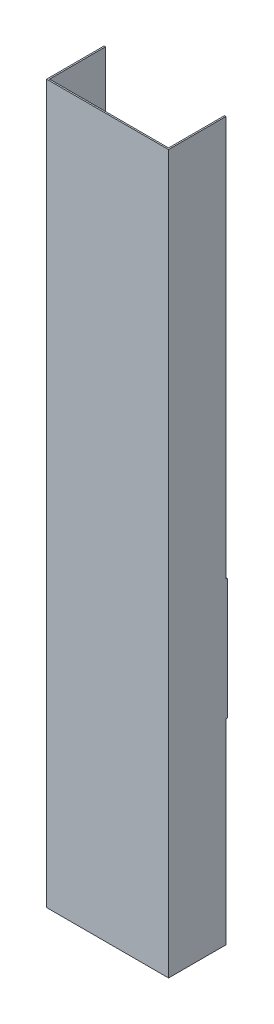
ISO-10303-21;
HEADER;
FILE_DESCRIPTION(('STEP AP214'),'2;1');
FILE_NAME('part.step','',(''),(''),'','','');
FILE_SCHEMA(('AUTOMOTIVE_DESIGN { 1 0 10303 214 1 1 1 1 }'));
ENDSEC;
DATA;
#1=APPLICATION_CONTEXT('core data for automotive mechanical design processes');
#2=APPLICATION_PROTOCOL_DEFINITION('international standard','automotive_design',2000,#1);
#3=PRODUCT_CONTEXT('',#1,'mechanical');
#4=PRODUCT('Part','Part','',(#3));
#5=PRODUCT_RELATED_PRODUCT_CATEGORY('part','',(#4));
#6=PRODUCT_DEFINITION_FORMATION('','',#4);
#7=PRODUCT_DEFINITION_CONTEXT('part definition',#1,'design');
#8=PRODUCT_DEFINITION('design','',#6,#7);
#9=PRODUCT_DEFINITION_SHAPE('','',#8);
#10=(LENGTH_UNIT() NAMED_UNIT(*) SI_UNIT(.MILLI.,.METRE.));
#11=(NAMED_UNIT(*) PLANE_ANGLE_UNIT() SI_UNIT($,.RADIAN.));
#12=(NAMED_UNIT(*) SI_UNIT($,.STERADIAN.) SOLID_ANGLE_UNIT());
#13=UNCERTAINTY_MEASURE_WITH_UNIT(LENGTH_MEASURE(1.E-05),#10,'distance_accuracy_value','');
#14=(GEOMETRIC_REPRESENTATION_CONTEXT(3) GLOBAL_UNCERTAINTY_ASSIGNED_CONTEXT((#13)) GLOBAL_UNIT_ASSIGNED_CONTEXT((#10,
#11,#12)) REPRESENTATION_CONTEXT('',''));
#15=CARTESIAN_POINT('',(0.,0.,0.));
#16=DIRECTION('',(0.,0.,1.));
#17=DIRECTION('',(1.,0.,0.));
#18=AXIS2_PLACEMENT_3D('',#15,#16,#17);
#19=CARTESIAN_POINT('',(1.,500.,0.));
#20=DIRECTION('',(0.,0.,1.));
#21=DIRECTION('',(1.,0.,0.));
#22=AXIS2_PLACEMENT_3D('',#19,#20,#21);
#23=PLANE('',#22);
#24=DIRECTION('',(-1.,0.,0.));
#25=VECTOR('',#24,1.);
#26=CARTESIAN_POINT('',(85.,136.481800745814,0.));
#27=LINE('',#26,#25);
#28=CARTESIAN_POINT('',(1.,136.481800745814,0.));
#29=VERTEX_POINT('',#28);
#30=CARTESIAN_POINT('',(0.,136.481800745814,0.));
#31=VERTEX_POINT('',#30);
#32=EDGE_CURVE('E232',#29,#31,#27,.T.);
#33=ORIENTED_EDGE('',*,*,#32,.F.);
#34=DIRECTION('',(0.,-1.,0.));
#35=VECTOR('',#34,1.);
#36=CARTESIAN_POINT('',(1.,500.,0.));
#37=LINE('',#36,#35);
#38=CARTESIAN_POINT('',(1.,0.,0.));
#39=VERTEX_POINT('',#38);
#40=EDGE_CURVE('E183',#29,#39,#37,.T.);
#41=ORIENTED_EDGE('',*,*,#40,.T.);
#42=DIRECTION('',(-1.,0.,0.));
#43=VECTOR('',#42,1.);
#44=CARTESIAN_POINT('',(1.,0.,0.));
#45=LINE('',#44,#43);
#46=CARTESIAN_POINT('',(0.,0.,0.));
#47=VERTEX_POINT('',#46);
#48=EDGE_CURVE('E159',#39,#47,#45,.T.);
#49=ORIENTED_EDGE('',*,*,#48,.T.);
#50=DIRECTION('',(0.,-1.,0.));
#51=VECTOR('',#50,1.);
#52=CARTESIAN_POINT('',(0.,500.,0.));
#53=LINE('',#52,#51);
#54=EDGE_CURVE('E39',#31,#47,#53,.T.);
#55=ORIENTED_EDGE('',*,*,#54,.F.);
#56=EDGE_LOOP('',(#33,#41,#49,#55));
#57=FACE_BOUND('',#56,.T.);
#58=ADVANCED_FACE('F32',(#57),#23,.F.);
#59=DIRECTION('',(1.,0.,0.));
#60=VECTOR('',#59,1.);
#61=CARTESIAN_POINT('',(85.,220.695563906895,0.));
#62=LINE('',#61,#60);
#63=CARTESIAN_POINT('',(0.,220.695563906895,0.));
#64=VERTEX_POINT('',#63);
#65=CARTESIAN_POINT('',(1.,220.695563906895,0.));
#66=VERTEX_POINT('',#65);
#67=EDGE_CURVE('E53',#64,#66,#62,.T.);
#68=ORIENTED_EDGE('',*,*,#67,.F.);
#69=CARTESIAN_POINT('',(0.,500.,0.));
#70=VERTEX_POINT('',#69);
#71=EDGE_CURVE('E11',#70,#64,#53,.T.);
#72=ORIENTED_EDGE('',*,*,#71,.F.);
#73=DIRECTION('',(-1.,0.,0.));
#74=VECTOR('',#73,1.);
#75=CARTESIAN_POINT('',(1.,500.,0.));
#76=LINE('',#75,#74);
#77=CARTESIAN_POINT('',(1.,500.,0.));
#78=VERTEX_POINT('',#77);
#79=EDGE_CURVE('E165',#78,#70,#76,.T.);
#80=ORIENTED_EDGE('',*,*,#79,.F.);
#81=EDGE_CURVE('E200',#78,#66,#37,.T.);
#82=ORIENTED_EDGE('',*,*,#81,.T.);
#83=EDGE_LOOP('',(#68,#72,#80,#82));
#84=FACE_BOUND('',#83,.T.);
#85=ADVANCED_FACE('F280',(#84),#23,.F.);
#86=CARTESIAN_POINT('',(85.,500.,0.));
#87=DIRECTION('',(0.,0.,1.));
#88=DIRECTION('',(1.,0.,0.));
#89=AXIS2_PLACEMENT_3D('',#86,#87,#88);
#90=PLANE('',#89);
#91=CARTESIAN_POINT('',(85.,136.481800745814,0.));
#92=VERTEX_POINT('',#91);
#93=CARTESIAN_POINT('',(84.,136.481800745814,0.));
#94=VERTEX_POINT('',#93);
#95=EDGE_CURVE('E270',#92,#94,#27,.T.);
#96=ORIENTED_EDGE('',*,*,#95,.F.);
#97=DIRECTION('',(0.,-1.,0.));
#98=VECTOR('',#97,1.);
#99=CARTESIAN_POINT('',(85.,500.,0.));
#100=LINE('',#99,#98);
#101=CARTESIAN_POINT('',(85.,0.,0.));
#102=VERTEX_POINT('',#101);
#103=EDGE_CURVE('E156',#92,#102,#100,.T.);
#104=ORIENTED_EDGE('',*,*,#103,.T.);
#105=DIRECTION('',(-1.,0.,0.));
#106=VECTOR('',#105,1.);
#107=CARTESIAN_POINT('',(85.,0.,0.));
#108=LINE('',#107,#106);
#109=CARTESIAN_POINT('',(84.,0.,0.));
#110=VERTEX_POINT('',#109);
#111=EDGE_CURVE('E191',#102,#110,#108,.T.);
#112=ORIENTED_EDGE('',*,*,#111,.T.);
#113=DIRECTION('',(0.,-1.,0.));
#114=VECTOR('',#113,1.);
#115=CARTESIAN_POINT('',(84.,500.,0.));
#116=LINE('',#115,#114);
#117=EDGE_CURVE('E209',#94,#110,#116,.T.);
#118=ORIENTED_EDGE('',*,*,#117,.F.);
#119=EDGE_LOOP('',(#96,#104,#112,#118));
#120=FACE_BOUND('',#119,.T.);
#121=ADVANCED_FACE('F251',(#120),#90,.F.);
#122=CARTESIAN_POINT('',(84.,220.695563906895,0.));
#123=VERTEX_POINT('',#122);
#124=CARTESIAN_POINT('',(85.,220.695563906895,0.));
#125=VERTEX_POINT('',#124);
#126=EDGE_CURVE('E269',#123,#125,#62,.T.);
#127=ORIENTED_EDGE('',*,*,#126,.F.);
#128=CARTESIAN_POINT('',(84.,500.,0.));
#129=VERTEX_POINT('',#128);
#130=EDGE_CURVE('E210',#129,#123,#116,.T.);
#131=ORIENTED_EDGE('',*,*,#130,.F.);
#132=DIRECTION('',(-1.,0.,0.));
#133=VECTOR('',#132,1.);
#134=CARTESIAN_POINT('',(85.,500.,0.));
#135=LINE('',#134,#133);
#136=CARTESIAN_POINT('',(85.,500.,0.));
#137=VERTEX_POINT('',#136);
#138=EDGE_CURVE('E175',#137,#129,#135,.T.);
#139=ORIENTED_EDGE('',*,*,#138,.F.);
#140=EDGE_CURVE('E213',#137,#125,#100,.T.);
#141=ORIENTED_EDGE('',*,*,#140,.T.);
#142=EDGE_LOOP('',(#127,#131,#139,#141));
#143=FACE_BOUND('',#142,.T.);
#144=ADVANCED_FACE('F286',(#143),#90,.F.);
#145=CARTESIAN_POINT('',(0.,500.,0.));
#146=DIRECTION('',(1.,0.,0.));
#147=DIRECTION('',(0.,0.,-1.));
#148=AXIS2_PLACEMENT_3D('',#145,#146,#147);
#149=PLANE('',#148);
#150=DIRECTION('',(0.,0.,1.));
#151=VECTOR('',#150,1.);
#152=CARTESIAN_POINT('',(0.,0.,0.));
#153=LINE('',#152,#151);
#154=CARTESIAN_POINT('',(0.,0.,40.));
#155=VERTEX_POINT('',#154);
#156=EDGE_CURVE('E185',#47,#155,#153,.T.);
#157=ORIENTED_EDGE('',*,*,#156,.T.);
#158=DIRECTION('',(0.,-1.,0.));
#159=VECTOR('',#158,1.);
#160=CARTESIAN_POINT('',(0.,500.,40.));
#161=LINE('',#160,#159);
#162=CARTESIAN_POINT('',(0.,500.,40.));
#163=VERTEX_POINT('',#162);
#164=EDGE_CURVE('E218',#163,#155,#161,.T.);
#165=ORIENTED_EDGE('',*,*,#164,.F.);
#166=DIRECTION('',(0.,0.,1.));
#167=VECTOR('',#166,1.);
#168=CARTESIAN_POINT('',(0.,500.,0.));
#169=LINE('',#168,#167);
#170=EDGE_CURVE('E168',#70,#163,#169,.T.);
#171=ORIENTED_EDGE('',*,*,#170,.F.);
#172=ORIENTED_EDGE('',*,*,#71,.T.);
#173=DIRECTION('',(0.,0.,1.));
#174=VECTOR('',#173,1.);
#175=CARTESIAN_POINT('',(0.,220.695563906895,-1.));
#176=LINE('',#175,#174);
#177=CARTESIAN_POINT('',(0.,220.695563906895,-1.));
#178=VERTEX_POINT('',#177);
#179=EDGE_CURVE('E161',#178,#64,#176,.T.);
#180=ORIENTED_EDGE('',*,*,#179,.F.);
#181=DIRECTION('',(0.,1.,0.));
#182=VECTOR('',#181,1.);
#183=CARTESIAN_POINT('',(0.,220.695563906895,-1.));
#184=LINE('',#183,#182);
#185=CARTESIAN_POINT('',(0.,136.481800745814,-1.));
#186=VERTEX_POINT('',#185);
#187=EDGE_CURVE('E142',#186,#178,#184,.T.);
#188=ORIENTED_EDGE('',*,*,#187,.F.);
#189=DIRECTION('',(0.,0.,1.));
#190=VECTOR('',#189,1.);
#191=CARTESIAN_POINT('',(0.,136.481800745814,-1.));
#192=LINE('',#191,#190);
#193=EDGE_CURVE('E139',#186,#31,#192,.T.);
#194=ORIENTED_EDGE('',*,*,#193,.T.);
#195=ORIENTED_EDGE('',*,*,#54,.T.);
#196=EDGE_LOOP('',(#157,#165,#171,#172,#180,#188,#194,#195));
#197=FACE_BOUND('',#196,.T.);
#198=ADVANCED_FACE('F226',(#197),#149,.F.);
#199=CARTESIAN_POINT('',(0.,500.,40.));
#200=DIRECTION('',(0.,0.,-1.));
#201=DIRECTION('',(-1.,0.,0.));
#202=AXIS2_PLACEMENT_3D('',#199,#200,#201);
#203=PLANE('',#202);
#204=DIRECTION('',(1.,0.,0.));
#205=VECTOR('',#204,1.);
#206=CARTESIAN_POINT('',(0.,0.,40.));
#207=LINE('',#206,#205);
#208=CARTESIAN_POINT('',(85.,0.,40.));
#209=VERTEX_POINT('',#208);
#210=EDGE_CURVE('E187',#155,#209,#207,.T.);
#211=ORIENTED_EDGE('',*,*,#210,.T.);
#212=DIRECTION('',(0.,-1.,0.));
#213=VECTOR('',#212,1.);
#214=CARTESIAN_POINT('',(85.,500.,40.));
#215=LINE('',#214,#213);
#216=CARTESIAN_POINT('',(85.,500.,40.));
#217=VERTEX_POINT('',#216);
#218=EDGE_CURVE('E216',#217,#209,#215,.T.);
#219=ORIENTED_EDGE('',*,*,#218,.F.);
#220=DIRECTION('',(1.,0.,0.));
#221=VECTOR('',#220,1.);
#222=CARTESIAN_POINT('',(0.,500.,40.));
#223=LINE('',#222,#221);
#224=EDGE_CURVE('E171',#163,#217,#223,.T.);
#225=ORIENTED_EDGE('',*,*,#224,.F.);
#226=ORIENTED_EDGE('',*,*,#164,.T.);
#227=EDGE_LOOP('',(#211,#219,#225,#226));
#228=FACE_BOUND('',#227,.T.);
#229=ADVANCED_FACE('F255',(#228),#203,.F.);
#230=CARTESIAN_POINT('',(85.,500.,40.));
#231=DIRECTION('',(-1.,0.,0.));
#232=DIRECTION('',(0.,0.,1.));
#233=AXIS2_PLACEMENT_3D('',#230,#231,#232);
#234=PLANE('',#233);
#235=DIRECTION('',(0.,0.,-1.));
#236=VECTOR('',#235,1.);
#237=CARTESIAN_POINT('',(85.,0.,40.));
#238=LINE('',#237,#236);
#239=EDGE_CURVE('E189',#209,#102,#238,.T.);
#240=ORIENTED_EDGE('',*,*,#239,.T.);
#241=ORIENTED_EDGE('',*,*,#103,.F.);
#242=DIRECTION('',(0.,0.,1.));
#243=VECTOR('',#242,1.);
#244=CARTESIAN_POINT('',(85.,136.481800745814,-1.));
#245=LINE('',#244,#243);
#246=CARTESIAN_POINT('',(85.,136.481800745814,-1.));
#247=VERTEX_POINT('',#246);
#248=EDGE_CURVE('E136',#247,#92,#245,.T.);
#249=ORIENTED_EDGE('',*,*,#248,.F.);
#250=DIRECTION('',(0.,-1.,0.));
#251=VECTOR('',#250,1.);
#252=CARTESIAN_POINT('',(85.,220.695563906895,-1.));
#253=LINE('',#252,#251);
#254=CARTESIAN_POINT('',(85.,220.695563906895,-1.));
#255=VERTEX_POINT('',#254);
#256=EDGE_CURVE('E143',#255,#247,#253,.T.);
#257=ORIENTED_EDGE('',*,*,#256,.F.);
#258=DIRECTION('',(0.,0.,1.));
#259=VECTOR('',#258,1.);
#260=CARTESIAN_POINT('',(85.,220.695563906895,-1.));
#261=LINE('',#260,#259);
#262=EDGE_CURVE('E264',#255,#125,#261,.T.);
#263=ORIENTED_EDGE('',*,*,#262,.T.);
#264=ORIENTED_EDGE('',*,*,#140,.F.);
#265=DIRECTION('',(0.,0.,-1.));
#266=VECTOR('',#265,1.);
#267=CARTESIAN_POINT('',(85.,500.,40.));
#268=LINE('',#267,#266);
#269=EDGE_CURVE('E173',#217,#137,#268,.T.);
#270=ORIENTED_EDGE('',*,*,#269,.F.);
#271=ORIENTED_EDGE('',*,*,#218,.T.);
#272=EDGE_LOOP('',(#240,#241,#249,#257,#263,#264,#270,#271));
#273=FACE_BOUND('',#272,.T.);
#274=ADVANCED_FACE('F155',(#273),#234,.F.);
#275=CARTESIAN_POINT('',(84.,500.,39.));
#276=DIRECTION('',(1.,0.,0.));
#277=DIRECTION('',(0.,0.,-1.));
#278=AXIS2_PLACEMENT_3D('',#275,#276,#277);
#279=PLANE('',#278);
#280=DIRECTION('',(0.,0.,1.));
#281=VECTOR('',#280,1.);
#282=CARTESIAN_POINT('',(84.,0.,39.));
#283=LINE('',#282,#281);
#284=CARTESIAN_POINT('',(84.,0.,39.));
#285=VERTEX_POINT('',#284);
#286=EDGE_CURVE('E194',#110,#285,#283,.T.);
#287=ORIENTED_EDGE('',*,*,#286,.T.);
#288=DIRECTION('',(0.,-1.,0.));
#289=VECTOR('',#288,1.);
#290=CARTESIAN_POINT('',(84.,500.,39.));
#291=LINE('',#290,#289);
#292=CARTESIAN_POINT('',(84.,500.,39.));
#293=VERTEX_POINT('',#292);
#294=EDGE_CURVE('E206',#293,#285,#291,.T.);
#295=ORIENTED_EDGE('',*,*,#294,.F.);
#296=DIRECTION('',(0.,0.,1.));
#297=VECTOR('',#296,1.);
#298=CARTESIAN_POINT('',(84.,500.,39.));
#299=LINE('',#298,#297);
#300=EDGE_CURVE('E177',#129,#293,#299,.T.);
#301=ORIENTED_EDGE('',*,*,#300,.F.);
#302=ORIENTED_EDGE('',*,*,#130,.T.);
#303=DIRECTION('',(0.,1.,0.));
#304=VECTOR('',#303,1.);
#305=CARTESIAN_POINT('',(84.,500.,0.));
#306=LINE('',#305,#304);
#307=EDGE_CURVE('E157',#94,#123,#306,.T.);
#308=ORIENTED_EDGE('',*,*,#307,.F.);
#309=ORIENTED_EDGE('',*,*,#117,.T.);
#310=EDGE_LOOP('',(#287,#295,#301,#302,#308,#309));
#311=FACE_BOUND('',#310,.T.);
#312=ADVANCED_FACE('F247',(#311),#279,.F.);
#313=CARTESIAN_POINT('',(1.,500.,39.));
#314=DIRECTION('',(0.,0.,1.));
#315=DIRECTION('',(1.,0.,0.));
#316=AXIS2_PLACEMENT_3D('',#313,#314,#315);
#317=PLANE('',#316);
#318=DIRECTION('',(-1.,0.,0.));
#319=VECTOR('',#318,1.);
#320=CARTESIAN_POINT('',(1.,0.,39.));
#321=LINE('',#320,#319);
#322=CARTESIAN_POINT('',(1.,0.,39.));
#323=VERTEX_POINT('',#322);
#324=EDGE_CURVE('E196',#285,#323,#321,.T.);
#325=ORIENTED_EDGE('',*,*,#324,.T.);
#326=DIRECTION('',(0.,-1.,0.));
#327=VECTOR('',#326,1.);
#328=CARTESIAN_POINT('',(1.,500.,39.));
#329=LINE('',#328,#327);
#330=CARTESIAN_POINT('',(1.,500.,39.));
#331=VERTEX_POINT('',#330);
#332=EDGE_CURVE('E202',#331,#323,#329,.T.);
#333=ORIENTED_EDGE('',*,*,#332,.F.);
#334=DIRECTION('',(-1.,0.,0.));
#335=VECTOR('',#334,1.);
#336=CARTESIAN_POINT('',(1.,500.,39.));
#337=LINE('',#336,#335);
#338=EDGE_CURVE('E179',#293,#331,#337,.T.);
#339=ORIENTED_EDGE('',*,*,#338,.F.);
#340=ORIENTED_EDGE('',*,*,#294,.T.);
#341=EDGE_LOOP('',(#325,#333,#339,#340));
#342=FACE_BOUND('',#341,.T.);
#343=ADVANCED_FACE('F242',(#342),#317,.F.);
#344=CARTESIAN_POINT('',(1.,500.,0.));
#345=DIRECTION('',(-1.,0.,0.));
#346=DIRECTION('',(0.,0.,1.));
#347=AXIS2_PLACEMENT_3D('',#344,#345,#346);
#348=PLANE('',#347);
#349=DIRECTION('',(0.,0.,-1.));
#350=VECTOR('',#349,1.);
#351=CARTESIAN_POINT('',(1.,0.,0.));
#352=LINE('',#351,#350);
#353=EDGE_CURVE('E169',#323,#39,#352,.T.);
#354=ORIENTED_EDGE('',*,*,#353,.T.);
#355=ORIENTED_EDGE('',*,*,#40,.F.);
#356=EDGE_CURVE('E203',#66,#29,#37,.T.);
#357=ORIENTED_EDGE('',*,*,#356,.F.);
#358=ORIENTED_EDGE('',*,*,#81,.F.);
#359=DIRECTION('',(0.,0.,-1.));
#360=VECTOR('',#359,1.);
#361=CARTESIAN_POINT('',(1.,500.,0.));
#362=LINE('',#361,#360);
#363=EDGE_CURVE('E181',#331,#78,#362,.T.);
#364=ORIENTED_EDGE('',*,*,#363,.F.);
#365=ORIENTED_EDGE('',*,*,#332,.T.);
#366=EDGE_LOOP('',(#354,#355,#357,#358,#364,#365));
#367=FACE_BOUND('',#366,.T.);
#368=ADVANCED_FACE('F235',(#367),#348,.F.);
#369=CARTESIAN_POINT('',(0.,500.,0.));
#370=DIRECTION('',(0.,1.,0.));
#371=DIRECTION('',(0.,0.,1.));
#372=AXIS2_PLACEMENT_3D('',#369,#370,#371);
#373=PLANE('',#372);
#374=ORIENTED_EDGE('',*,*,#79,.T.);
#375=ORIENTED_EDGE('',*,*,#170,.T.);
#376=ORIENTED_EDGE('',*,*,#224,.T.);
#377=ORIENTED_EDGE('',*,*,#269,.T.);
#378=ORIENTED_EDGE('',*,*,#138,.T.);
#379=ORIENTED_EDGE('',*,*,#300,.T.);
#380=ORIENTED_EDGE('',*,*,#338,.T.);
#381=ORIENTED_EDGE('',*,*,#363,.T.);
#382=EDGE_LOOP('',(#374,#375,#376,#377,#378,#379,#380,#381));
#383=FACE_BOUND('',#382,.T.);
#384=ADVANCED_FACE('F257',(#383),#373,.T.);
#385=CARTESIAN_POINT('',(0.,0.,0.));
#386=DIRECTION('',(0.,1.,0.));
#387=DIRECTION('',(0.,0.,1.));
#388=AXIS2_PLACEMENT_3D('',#385,#386,#387);
#389=PLANE('',#388);
#390=ORIENTED_EDGE('',*,*,#48,.F.);
#391=ORIENTED_EDGE('',*,*,#353,.F.);
#392=ORIENTED_EDGE('',*,*,#324,.F.);
#393=ORIENTED_EDGE('',*,*,#286,.F.);
#394=ORIENTED_EDGE('',*,*,#111,.F.);
#395=ORIENTED_EDGE('',*,*,#239,.F.);
#396=ORIENTED_EDGE('',*,*,#210,.F.);
#397=ORIENTED_EDGE('',*,*,#156,.F.);
#398=EDGE_LOOP('',(#390,#391,#392,#393,#394,#395,#396,#397));
#399=FACE_BOUND('',#398,.T.);
#400=ADVANCED_FACE('F229',(#399),#389,.F.);
#401=CARTESIAN_POINT('',(0.,0.,0.));
#402=DIRECTION('',(0.,0.,-1.));
#403=DIRECTION('',(-1.,0.,0.));
#404=AXIS2_PLACEMENT_3D('',#401,#402,#403);
#405=PLANE('',#404);
#406=EDGE_CURVE('E272',#94,#29,#27,.T.);
#407=ORIENTED_EDGE('',*,*,#406,.F.);
#408=ORIENTED_EDGE('',*,*,#307,.T.);
#409=EDGE_CURVE('E268',#66,#123,#62,.T.);
#410=ORIENTED_EDGE('',*,*,#409,.F.);
#411=ORIENTED_EDGE('',*,*,#356,.T.);
#412=EDGE_LOOP('',(#407,#408,#410,#411));
#413=FACE_BOUND('',#412,.T.);
#414=ADVANCED_FACE('F277',(#413),#405,.F.);
#415=CARTESIAN_POINT('',(85.,136.481800745814,-1.));
#416=DIRECTION('',(0.,1.,0.));
#417=DIRECTION('',(-1.,0.,0.));
#418=AXIS2_PLACEMENT_3D('',#415,#416,#417);
#419=PLANE('',#418);
#420=ORIENTED_EDGE('',*,*,#95,.T.);
#421=ORIENTED_EDGE('',*,*,#406,.T.);
#422=ORIENTED_EDGE('',*,*,#32,.T.);
#423=ORIENTED_EDGE('',*,*,#193,.F.);
#424=DIRECTION('',(-1.,0.,0.));
#425=VECTOR('',#424,1.);
#426=CARTESIAN_POINT('',(85.,136.481800745814,-1.));
#427=LINE('',#426,#425);
#428=EDGE_CURVE('E132',#247,#186,#427,.T.);
#429=ORIENTED_EDGE('',*,*,#428,.F.);
#430=ORIENTED_EDGE('',*,*,#248,.T.);
#431=EDGE_LOOP('',(#420,#421,#422,#423,#429,#430));
#432=FACE_BOUND('',#431,.T.);
#433=ADVANCED_FACE('F134',(#432),#419,.F.);
#434=CARTESIAN_POINT('',(85.,220.695563906895,-1.));
#435=DIRECTION('',(0.,-1.,0.));
#436=DIRECTION('',(1.,0.,0.));
#437=AXIS2_PLACEMENT_3D('',#434,#435,#436);
#438=PLANE('',#437);
#439=ORIENTED_EDGE('',*,*,#67,.T.);
#440=ORIENTED_EDGE('',*,*,#409,.T.);
#441=ORIENTED_EDGE('',*,*,#126,.T.);
#442=ORIENTED_EDGE('',*,*,#262,.F.);
#443=DIRECTION('',(1.,0.,0.));
#444=VECTOR('',#443,1.);
#445=CARTESIAN_POINT('',(85.,220.695563906895,-1.));
#446=LINE('',#445,#444);
#447=EDGE_CURVE('E148',#178,#255,#446,.T.);
#448=ORIENTED_EDGE('',*,*,#447,.F.);
#449=ORIENTED_EDGE('',*,*,#179,.T.);
#450=EDGE_LOOP('',(#439,#440,#441,#442,#448,#449));
#451=FACE_BOUND('',#450,.T.);
#452=ADVANCED_FACE('F262',(#451),#438,.F.);
#453=CARTESIAN_POINT('',(0.,0.,-1.));
#454=DIRECTION('',(0.,0.,-1.));
#455=DIRECTION('',(-1.,0.,0.));
#456=AXIS2_PLACEMENT_3D('',#453,#454,#455);
#457=PLANE('',#456);
#458=ORIENTED_EDGE('',*,*,#256,.T.);
#459=ORIENTED_EDGE('',*,*,#428,.T.);
#460=ORIENTED_EDGE('',*,*,#187,.T.);
#461=ORIENTED_EDGE('',*,*,#447,.T.);
#462=EDGE_LOOP('',(#458,#459,#460,#461));
#463=FACE_BOUND('',#462,.T.);
#464=ADVANCED_FACE('F146',(#463),#457,.T.);
#465=CLOSED_SHELL('',(#58,#85,#121,#144,#198,#229,#274,#312,#343,#368,#384,#400,#414,#433,#452,#464));
#466=MANIFOLD_SOLID_BREP('B2',#465);
#467=ADVANCED_BREP_SHAPE_REPRESENTATION('',(#18,#466),#14);
#468=SHAPE_DEFINITION_REPRESENTATION(#9,#467);
ENDSEC;
END-ISO-10303-21;
